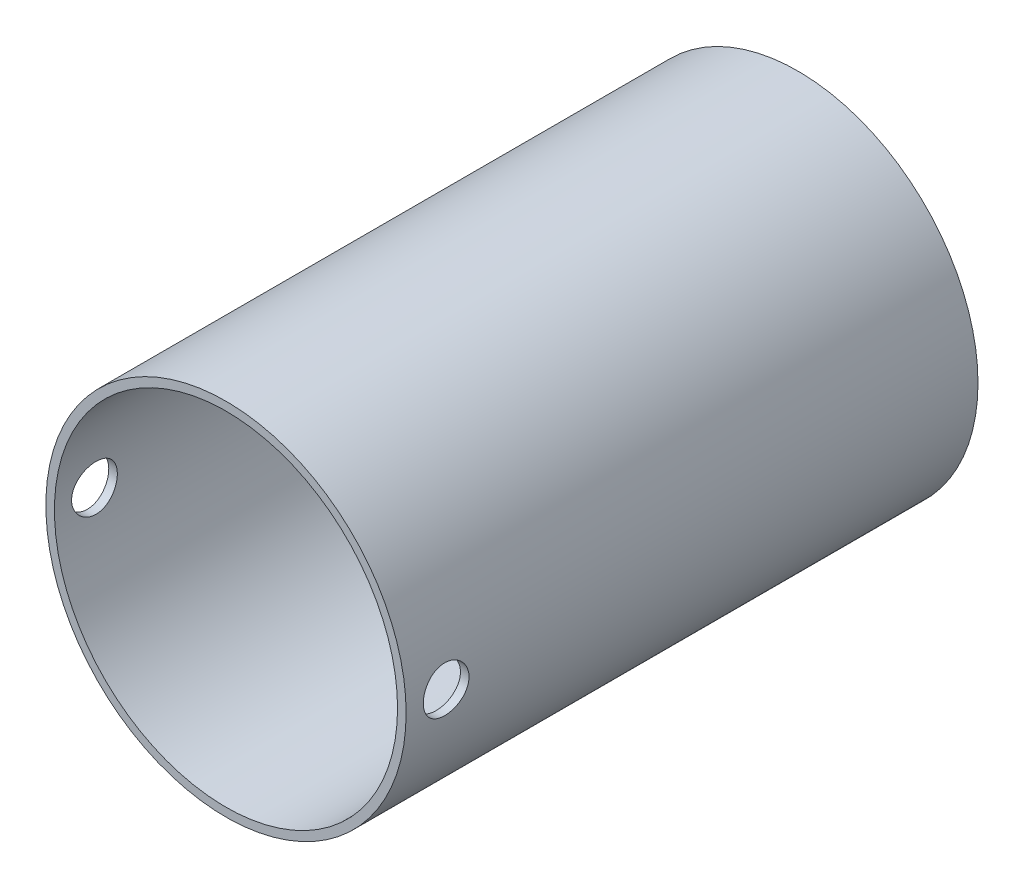
ISO-10303-21;
HEADER;
FILE_DESCRIPTION(('STEP AP214'),'2;1');
FILE_NAME('part.step','',(''),(''),'','','');
FILE_SCHEMA(('AUTOMOTIVE_DESIGN { 1 0 10303 214 1 1 1 1 }'));
ENDSEC;
DATA;
#1=APPLICATION_CONTEXT('core data for automotive mechanical design processes');
#2=APPLICATION_PROTOCOL_DEFINITION('international standard','automotive_design',2000,#1);
#3=PRODUCT_CONTEXT('',#1,'mechanical');
#4=PRODUCT('Part','Part','',(#3));
#5=PRODUCT_RELATED_PRODUCT_CATEGORY('part','',(#4));
#6=PRODUCT_DEFINITION_FORMATION('','',#4);
#7=PRODUCT_DEFINITION_CONTEXT('part definition',#1,'design');
#8=PRODUCT_DEFINITION('design','',#6,#7);
#9=PRODUCT_DEFINITION_SHAPE('','',#8);
#10=(LENGTH_UNIT() NAMED_UNIT(*) SI_UNIT(.MILLI.,.METRE.));
#11=(NAMED_UNIT(*) PLANE_ANGLE_UNIT() SI_UNIT($,.RADIAN.));
#12=(NAMED_UNIT(*) SI_UNIT($,.STERADIAN.) SOLID_ANGLE_UNIT());
#13=UNCERTAINTY_MEASURE_WITH_UNIT(LENGTH_MEASURE(1.E-05),#10,'distance_accuracy_value','');
#14=(GEOMETRIC_REPRESENTATION_CONTEXT(3) GLOBAL_UNCERTAINTY_ASSIGNED_CONTEXT((#13)) GLOBAL_UNIT_ASSIGNED_CONTEXT((#10,
#11,#12)) REPRESENTATION_CONTEXT('',''));
#15=CARTESIAN_POINT('',(0.,0.,0.));
#16=DIRECTION('',(0.,0.,1.));
#17=DIRECTION('',(1.,0.,0.));
#18=AXIS2_PLACEMENT_3D('',#15,#16,#17);
#19=CARTESIAN_POINT('',(0.,0.,100.));
#20=DIRECTION('',(0.,0.,1.));
#21=DIRECTION('',(1.,0.,0.));
#22=AXIS2_PLACEMENT_3D('',#19,#20,#21);
#23=PLANE('',#22);
#24=CARTESIAN_POINT('',(0.,0.,100.));
#25=DIRECTION('',(0.,0.,1.));
#26=DIRECTION('',(1.,0.,0.));
#27=AXIS2_PLACEMENT_3D('',#24,#25,#26);
#28=CIRCLE('',#27,31.5);
#29=CARTESIAN_POINT('',(31.5,0.,100.));
#30=VERTEX_POINT('',#29);
#31=EDGE_CURVE('E10',#30,#30,#28,.T.);
#32=ORIENTED_EDGE('',*,*,#31,.T.);
#33=EDGE_LOOP('',(#32));
#34=FACE_BOUND('',#33,.T.);
#35=CARTESIAN_POINT('',(0.,0.,100.));
#36=DIRECTION('',(0.,0.,1.));
#37=DIRECTION('',(1.,0.,0.));
#38=AXIS2_PLACEMENT_3D('',#35,#36,#37);
#39=CIRCLE('',#38,30.);
#40=CARTESIAN_POINT('',(30.,0.,100.));
#41=VERTEX_POINT('',#40);
#42=EDGE_CURVE('E62',#41,#41,#39,.T.);
#43=ORIENTED_EDGE('',*,*,#42,.F.);
#44=EDGE_LOOP('',(#43));
#45=FACE_BOUND('',#44,.T.);
#46=ADVANCED_FACE('F41',(#34,#45),#23,.T.);
#47=CARTESIAN_POINT('',(0.,0.,0.));
#48=DIRECTION('',(0.,0.,1.));
#49=DIRECTION('',(1.,0.,0.));
#50=AXIS2_PLACEMENT_3D('',#47,#48,#49);
#51=PLANE('',#50);
#52=CARTESIAN_POINT('',(0.,0.,0.));
#53=DIRECTION('',(0.,0.,1.));
#54=DIRECTION('',(1.,0.,0.));
#55=AXIS2_PLACEMENT_3D('',#52,#53,#54);
#56=CIRCLE('',#55,31.5);
#57=CARTESIAN_POINT('',(31.5,0.,0.));
#58=VERTEX_POINT('',#57);
#59=EDGE_CURVE('E56',#58,#58,#56,.T.);
#60=ORIENTED_EDGE('',*,*,#59,.F.);
#61=EDGE_LOOP('',(#60));
#62=FACE_BOUND('',#61,.T.);
#63=CARTESIAN_POINT('',(0.,0.,0.));
#64=DIRECTION('',(0.,0.,1.));
#65=DIRECTION('',(1.,0.,0.));
#66=AXIS2_PLACEMENT_3D('',#63,#64,#65);
#67=CIRCLE('',#66,30.);
#68=CARTESIAN_POINT('',(30.,0.,0.));
#69=VERTEX_POINT('',#68);
#70=EDGE_CURVE('E65',#69,#69,#67,.T.);
#71=ORIENTED_EDGE('',*,*,#70,.T.);
#72=EDGE_LOOP('',(#71));
#73=FACE_BOUND('',#72,.T.);
#74=ADVANCED_FACE('F106',(#62,#73),#51,.F.);
#75=CARTESIAN_POINT('',(0.,0.,100.));
#76=DIRECTION('',(0.,0.,-1.));
#77=DIRECTION('',(-1.,0.,0.));
#78=AXIS2_PLACEMENT_3D('',#75,#76,#77);
#79=CYLINDRICAL_SURFACE('',#78,31.5);
#80=CARTESIAN_POINT('',(-31.5,0.,89.));
#81=CARTESIAN_POINT('',(-31.4999968385272,0.223715988029636,89.0000094860178));
#82=CARTESIAN_POINT('',(-31.4975915656665,0.447571046953038,89.0188316023286));
#83=CARTESIAN_POINT('',(-31.4882278259735,0.889050007646821,89.0936184412233));
#84=CARTESIAN_POINT('',(-31.4812646283541,1.10666718973841,89.1496217559896));
#85=CARTESIAN_POINT('',(-31.4635693402177,1.52921533330555,89.29709264295));
#86=CARTESIAN_POINT('',(-31.452839809906,1.73415480156244,89.3885361286895));
#87=CARTESIAN_POINT('',(-31.4288046328235,2.12574055461283,89.6042384691209));
#88=CARTESIAN_POINT('',(-31.4154994218823,2.31238992622698,89.7284917733744));
#89=CARTESIAN_POINT('',(-31.3877135536644,2.66319458837522,90.0070401736119));
#90=CARTESIAN_POINT('',(-31.3732272833207,2.82723114008826,90.1614842648427));
#91=CARTESIAN_POINT('',(-31.3447571495527,3.12713101980096,90.4957101735464));
#92=CARTESIAN_POINT('',(-31.330773311993,3.26299289911508,90.6754932931038));
#93=CARTESIAN_POINT('',(-31.3048361557336,3.50313059708383,91.0560674820019));
#94=CARTESIAN_POINT('',(-31.2928900697002,3.60729489508019,91.2569294549346));
#95=CARTESIAN_POINT('',(-31.2724552247304,3.78036835194999,91.6734725666853));
#96=CARTESIAN_POINT('',(-31.2639663305768,3.84927888969153,91.8891531255348));
#97=CARTESIAN_POINT('',(-31.2514607408546,3.94952729224959,92.3279773835993));
#98=CARTESIAN_POINT('',(-31.2474201634467,3.98106586774558,92.551074538426));
#99=CARTESIAN_POINT('',(-31.2441956526057,4.00629620054563,92.9994288649798));
#100=CARTESIAN_POINT('',(-31.2450115178251,3.99998952690939,93.22468594677));
#101=CARTESIAN_POINT('',(-31.2513858552307,3.94987309056605,93.6695657327025));
#102=CARTESIAN_POINT('',(-31.2569163452738,3.90628459707475,93.8892138211563));
#103=CARTESIAN_POINT('',(-31.2720531348819,3.78318715505679,94.3180524005092));
#104=CARTESIAN_POINT('',(-31.2816595194392,3.70367745748402,94.527242673236));
#105=CARTESIAN_POINT('',(-31.3038973648617,3.5107573288836,94.9299138357906));
#106=CARTESIAN_POINT('',(-31.3165373696133,3.39725092155177,95.1233482521866));
#107=CARTESIAN_POINT('',(-31.3434116686128,3.13962804024007,95.4885074957042));
#108=CARTESIAN_POINT('',(-31.357646038089,2.99551012160296,95.6602312976205));
#109=CARTESIAN_POINT('',(-31.3862295409855,2.67952976741088,95.9783788820895));
#110=CARTESIAN_POINT('',(-31.4005787683682,2.50747664413859,96.1246133340613));
#111=CARTESIAN_POINT('',(-31.4276801792938,2.14116591323289,96.386156388007));
#112=CARTESIAN_POINT('',(-31.4404323589506,1.94690825156947,96.5014649147269));
#113=CARTESIAN_POINT('',(-31.4629111251128,1.54155537823476,96.6978837716117));
#114=CARTESIAN_POINT('',(-31.4726366447289,1.33045426216087,96.7789820463288));
#115=CARTESIAN_POINT('',(-31.4879566727442,0.897479561472162,96.9045269748191));
#116=CARTESIAN_POINT('',(-31.4935513807666,0.67560649796854,96.9489753997238));
#117=CARTESIAN_POINT('',(-31.4999534285672,0.229022889366789,96.9997130494362));
#118=CARTESIAN_POINT('',(-31.5007934836124,0.00434242215663762,97.00626304833));
#119=CARTESIAN_POINT('',(-31.4976799565989,-0.442913058577919,96.9817063930831));
#120=CARTESIAN_POINT('',(-31.4937264799686,-0.665488118299924,96.9506005671406));
#121=CARTESIAN_POINT('',(-31.4814904877344,-1.10144374404205,96.8518318962107));
#122=CARTESIAN_POINT('',(-31.473222722907,-1.31485297428713,96.7842935893838));
#123=CARTESIAN_POINT('',(-31.4532836620352,-1.72731635019035,96.6147067350875));
#124=CARTESIAN_POINT('',(-31.4416122470706,-1.92636999397529,96.5126569818022));
#125=CARTESIAN_POINT('',(-31.4160852471459,-2.30563511866451,96.2763145258608));
#126=CARTESIAN_POINT('',(-31.4022183857714,-2.4857408582415,96.1418533762043));
#127=CARTESIAN_POINT('',(-31.373886434308,-2.82092133636619,95.8447430151219));
#128=CARTESIAN_POINT('',(-31.3594213197024,-2.97599504780794,95.6820926476129));
#129=CARTESIAN_POINT('',(-31.3314220283463,-3.25763645168321,95.3320712926267));
#130=CARTESIAN_POINT('',(-31.3178938267114,-3.38403113744103,95.1445605491064));
#131=CARTESIAN_POINT('',(-31.293398902391,-3.60353087261144,94.7508183998289));
#132=CARTESIAN_POINT('',(-31.2824321269796,-3.69663660728627,94.5445873795433));
#133=CARTESIAN_POINT('',(-31.2643426408956,-3.84663628723283,94.1198139454469));
#134=CARTESIAN_POINT('',(-31.2572096339925,-3.903627299211,93.9013062659036));
#135=CARTESIAN_POINT('',(-31.2475659310234,-3.98009210669879,93.4577258637377));
#136=CARTESIAN_POINT('',(-31.2450550124773,-3.99956770798083,93.2326534576322));
#137=CARTESIAN_POINT('',(-31.244946400951,-4.00041500529707,92.7840539863469));
#138=CARTESIAN_POINT('',(-31.2473136596187,-3.98205851430746,92.5605273944412));
#139=CARTESIAN_POINT('',(-31.2566192596448,-3.90833879568297,92.1197641943916));
#140=CARTESIAN_POINT('',(-31.2635576010018,-3.85297556805973,91.9025275862458));
#141=CARTESIAN_POINT('',(-31.2812126450123,-3.70689975530109,91.4805495834385));
#142=CARTESIAN_POINT('',(-31.2919279013377,-3.6162007002348,91.2758034408484));
#143=CARTESIAN_POINT('',(-31.3159317720176,-3.40205458104029,90.8843928132592));
#144=CARTESIAN_POINT('',(-31.3292204226875,-3.27860705476148,90.6977285834851));
#145=CARTESIAN_POINT('',(-31.3569881289507,-3.00146122414133,90.3463915971546));
#146=CARTESIAN_POINT('',(-31.3714747534284,-2.84756041362568,90.1818791703885));
#147=CARTESIAN_POINT('',(-31.3999395620211,-2.51429978698193,89.8809114523834));
#148=CARTESIAN_POINT('',(-31.4139176255988,-2.33493398398539,89.7444627775111));
#149=CARTESIAN_POINT('',(-31.4398510921941,-1.95502619095532,89.5030382329854));
#150=CARTESIAN_POINT('',(-31.4517983479301,-1.75440391254395,89.3981878893078));
#151=CARTESIAN_POINT('',(-31.4722417520154,-1.33835826680321,89.2238162935201));
#152=CARTESIAN_POINT('',(-31.4807416355615,-1.12295121622904,89.1542567834869));
#153=CARTESIAN_POINT('',(-31.4912914915295,-0.755366800765215,89.0690286687568));
#154=CARTESIAN_POINT('',(-31.4945412100071,-0.605504101781294,89.0431802905911));
#155=CARTESIAN_POINT('',(-31.4988965294497,-0.303782303051817,89.0086628014211));
#156=CARTESIAN_POINT('',(-31.5000021469235,-0.151923218686825,88.9999935581432));
#157=CARTESIAN_POINT('',(-31.5,0.,89.));
#158=B_SPLINE_CURVE_WITH_KNOTS('',3,(#80,#81,#82,#83,#84,#85,#86,#87,#88,#89,#90,#91,#92,#93,
#94,#95,#96,#97,#98,#99,#100,#101,#102,#103,#104,#105,#106,#107,#108,#109,#110,#111,#112,#113,
#114,#115,#116,#117,#118,#119,#120,#121,#122,#123,#124,#125,#126,#127,#128,#129,#130,#131,#132,
#133,#134,#135,#136,#137,#138,#139,#140,#141,#142,#143,#144,#145,#146,#147,#148,#149,#150,#151,
#152,#153,#154,#155,#156,#157),.UNSPECIFIED.,.T.,.F.,(4,2,2,2,2,2,2,2,2,2,2,2,2,2,2,2,2,2,2,2,2,
2,2,2,2,2,2,2,2,2,2,2,2,2,2,2,2,2,4),(0.,0.670593021042296,1.34188317380553,2.01271789068873,
2.68343919505851,3.35755819670733,4.03171185162278,4.70821064582307,5.38468297833752,
6.05750552549398,6.73030017769763,7.39912925432749,8.06797227834447,8.738721605591,
9.40950259472595,10.0850713656251,10.7606417804119,11.4364500629031,12.1122256845373,
12.7833458014479,13.4544511580829,14.123276860759,14.7921259343465,15.4645290510101,
16.1369597504884,16.8133450010221,17.4897163271775,18.1642619504989,18.8387751043285,
19.5084589678988,20.1781428312585,20.8475705246481,21.5170076655889,22.1910557893549,
22.8652626463561,23.542113551401,24.2182291227463,24.6736254291239,25.1290182290885),.UNSPECIFIED.);
#159=CARTESIAN_POINT('',(-31.5,0.,89.));
#160=VERTEX_POINT('',#159);
#161=EDGE_CURVE('E92',#160,#160,#158,.T.);
#162=ORIENTED_EDGE('',*,*,#161,.T.);
#163=EDGE_LOOP('',(#162));
#164=FACE_BOUND('',#163,.T.);
#165=CARTESIAN_POINT('',(31.5,0.,89.));
#166=CARTESIAN_POINT('',(31.4999968385272,-0.223715988029636,89.0000094860178));
#167=CARTESIAN_POINT('',(31.4975915656665,-0.447571046953038,89.0188316023286));
#168=CARTESIAN_POINT('',(31.4882278259735,-0.889050007646821,89.0936184412233));
#169=CARTESIAN_POINT('',(31.4812646283541,-1.10666718973841,89.1496217559896));
#170=CARTESIAN_POINT('',(31.4635693402177,-1.52921533330555,89.29709264295));
#171=CARTESIAN_POINT('',(31.452839809906,-1.73415480156244,89.3885361286895));
#172=CARTESIAN_POINT('',(31.4288046328235,-2.12574055461283,89.6042384691209));
#173=CARTESIAN_POINT('',(31.4154994218823,-2.31238992622698,89.7284917733744));
#174=CARTESIAN_POINT('',(31.3877135536644,-2.66319458837522,90.0070401736119));
#175=CARTESIAN_POINT('',(31.3732272833207,-2.82723114008826,90.1614842648427));
#176=CARTESIAN_POINT('',(31.3447571495527,-3.12713101980096,90.4957101735464));
#177=CARTESIAN_POINT('',(31.330773311993,-3.26299289911508,90.6754932931038));
#178=CARTESIAN_POINT('',(31.3048361557336,-3.50313059708383,91.0560674820019));
#179=CARTESIAN_POINT('',(31.2928900697002,-3.60729489508019,91.2569294549346));
#180=CARTESIAN_POINT('',(31.2724552247304,-3.78036835194999,91.6734725666853));
#181=CARTESIAN_POINT('',(31.2639663305768,-3.84927888969153,91.8891531255348));
#182=CARTESIAN_POINT('',(31.2514607408546,-3.94952729224959,92.3279773835993));
#183=CARTESIAN_POINT('',(31.2474201634467,-3.98106586774558,92.551074538426));
#184=CARTESIAN_POINT('',(31.2441956526057,-4.00629620054563,92.9994288649798));
#185=CARTESIAN_POINT('',(31.2450115178251,-3.99998952690939,93.22468594677));
#186=CARTESIAN_POINT('',(31.2513858552307,-3.94987309056605,93.6695657327025));
#187=CARTESIAN_POINT('',(31.2569163452738,-3.90628459707475,93.8892138211563));
#188=CARTESIAN_POINT('',(31.2720531348819,-3.78318715505679,94.3180524005092));
#189=CARTESIAN_POINT('',(31.2816595194392,-3.70367745748402,94.527242673236));
#190=CARTESIAN_POINT('',(31.3038973648617,-3.5107573288836,94.9299138357906));
#191=CARTESIAN_POINT('',(31.3165373696133,-3.39725092155177,95.1233482521866));
#192=CARTESIAN_POINT('',(31.3434116686128,-3.13962804024007,95.4885074957042));
#193=CARTESIAN_POINT('',(31.357646038089,-2.99551012160296,95.6602312976205));
#194=CARTESIAN_POINT('',(31.3862295409855,-2.67952976741088,95.9783788820895));
#195=CARTESIAN_POINT('',(31.4005787683682,-2.50747664413859,96.1246133340613));
#196=CARTESIAN_POINT('',(31.4276801792938,-2.14116591323289,96.386156388007));
#197=CARTESIAN_POINT('',(31.4404323589506,-1.94690825156947,96.5014649147269));
#198=CARTESIAN_POINT('',(31.4629111251128,-1.54155537823476,96.6978837716117));
#199=CARTESIAN_POINT('',(31.4726366447289,-1.33045426216087,96.7789820463288));
#200=CARTESIAN_POINT('',(31.4879566727442,-0.897479561472162,96.9045269748191));
#201=CARTESIAN_POINT('',(31.4935513807666,-0.67560649796854,96.9489753997238));
#202=CARTESIAN_POINT('',(31.4999534285672,-0.229022889366789,96.9997130494362));
#203=CARTESIAN_POINT('',(31.5007934836124,-0.00434242215663762,97.00626304833));
#204=CARTESIAN_POINT('',(31.4976799565989,0.442913058577919,96.9817063930831));
#205=CARTESIAN_POINT('',(31.4937264799686,0.665488118299924,96.9506005671406));
#206=CARTESIAN_POINT('',(31.4814904877344,1.10144374404205,96.8518318962107));
#207=CARTESIAN_POINT('',(31.473222722907,1.31485297428713,96.7842935893838));
#208=CARTESIAN_POINT('',(31.4532836620352,1.72731635019035,96.6147067350875));
#209=CARTESIAN_POINT('',(31.4416122470706,1.92636999397529,96.5126569818022));
#210=CARTESIAN_POINT('',(31.4160852471459,2.30563511866451,96.2763145258608));
#211=CARTESIAN_POINT('',(31.4022183857714,2.4857408582415,96.1418533762043));
#212=CARTESIAN_POINT('',(31.373886434308,2.82092133636619,95.8447430151219));
#213=CARTESIAN_POINT('',(31.3594213197024,2.97599504780794,95.6820926476129));
#214=CARTESIAN_POINT('',(31.3314220283463,3.25763645168321,95.3320712926267));
#215=CARTESIAN_POINT('',(31.3178938267114,3.38403113744103,95.1445605491064));
#216=CARTESIAN_POINT('',(31.293398902391,3.60353087261144,94.7508183998289));
#217=CARTESIAN_POINT('',(31.2824321269796,3.69663660728627,94.5445873795433));
#218=CARTESIAN_POINT('',(31.2643426408956,3.84663628723283,94.1198139454469));
#219=CARTESIAN_POINT('',(31.2572096339925,3.903627299211,93.9013062659036));
#220=CARTESIAN_POINT('',(31.2475659310234,3.98009210669879,93.4577258637377));
#221=CARTESIAN_POINT('',(31.2450550124773,3.99956770798083,93.2326534576322));
#222=CARTESIAN_POINT('',(31.244946400951,4.00041500529707,92.7840539863469));
#223=CARTESIAN_POINT('',(31.2473136596187,3.98205851430746,92.5605273944412));
#224=CARTESIAN_POINT('',(31.2566192596448,3.90833879568297,92.1197641943916));
#225=CARTESIAN_POINT('',(31.2635576010018,3.85297556805973,91.9025275862458));
#226=CARTESIAN_POINT('',(31.2812126450123,3.70689975530109,91.4805495834385));
#227=CARTESIAN_POINT('',(31.2919279013377,3.6162007002348,91.2758034408484));
#228=CARTESIAN_POINT('',(31.3159317720176,3.40205458104029,90.8843928132592));
#229=CARTESIAN_POINT('',(31.3292204226875,3.27860705476148,90.6977285834851));
#230=CARTESIAN_POINT('',(31.3569881289507,3.00146122414133,90.3463915971546));
#231=CARTESIAN_POINT('',(31.3714747534284,2.84756041362568,90.1818791703885));
#232=CARTESIAN_POINT('',(31.3999395620211,2.51429978698193,89.8809114523834));
#233=CARTESIAN_POINT('',(31.4139176255988,2.33493398398539,89.7444627775111));
#234=CARTESIAN_POINT('',(31.4398510921941,1.95502619095532,89.5030382329854));
#235=CARTESIAN_POINT('',(31.4517983479301,1.75440391254395,89.3981878893078));
#236=CARTESIAN_POINT('',(31.4722417520154,1.33835826680321,89.2238162935201));
#237=CARTESIAN_POINT('',(31.4807416355615,1.12295121622904,89.1542567834869));
#238=CARTESIAN_POINT('',(31.4912914915295,0.755366800765215,89.0690286687568));
#239=CARTESIAN_POINT('',(31.4945412100071,0.605504101781294,89.0431802905911));
#240=CARTESIAN_POINT('',(31.4988965294497,0.303782303051817,89.0086628014211));
#241=CARTESIAN_POINT('',(31.5000021469235,0.151923218686825,88.9999935581432));
#242=CARTESIAN_POINT('',(31.5,0.,89.));
#243=B_SPLINE_CURVE_WITH_KNOTS('',3,(#165,#166,#167,#168,#169,#170,#171,#172,#173,#174,#175,
#176,#177,#178,#179,#180,#181,#182,#183,#184,#185,#186,#187,#188,#189,#190,#191,#192,#193,#194,
#195,#196,#197,#198,#199,#200,#201,#202,#203,#204,#205,#206,#207,#208,#209,#210,#211,#212,#213,
#214,#215,#216,#217,#218,#219,#220,#221,#222,#223,#224,#225,#226,#227,#228,#229,#230,#231,#232,
#233,#234,#235,#236,#237,#238,#239,#240,#241,#242),.UNSPECIFIED.,.T.,.F.,(4,2,2,2,2,2,2,2,2,2,2,
2,2,2,2,2,2,2,2,2,2,2,2,2,2,2,2,2,2,2,2,2,2,2,2,2,2,2,4),(0.,0.670593021042296,1.34188317380553,
2.01271789068873,2.68343919505851,3.35755819670733,4.03171185162278,4.70821064582307,
5.38468297833752,6.05750552549398,6.73030017769763,7.39912925432749,8.06797227834447,
8.738721605591,9.40950259472595,10.0850713656251,10.7606417804119,11.4364500629031,
12.1122256845373,12.7833458014479,13.4544511580829,14.123276860759,14.7921259343465,
15.4645290510101,16.1369597504884,16.8133450010221,17.4897163271775,18.1642619504989,
18.8387751043285,19.5084589678988,20.1781428312585,20.8475705246481,21.5170076655889,
22.1910557893549,22.8652626463561,23.542113551401,24.2182291227463,24.6736254291239,
25.1290182290885),.UNSPECIFIED.);
#244=CARTESIAN_POINT('',(31.5,0.,89.));
#245=VERTEX_POINT('',#244);
#246=EDGE_CURVE('E86',#245,#245,#243,.T.);
#247=ORIENTED_EDGE('',*,*,#246,.T.);
#248=EDGE_LOOP('',(#247));
#249=FACE_BOUND('',#248,.T.);
#250=ORIENTED_EDGE('',*,*,#31,.F.);
#251=EDGE_LOOP('',(#250));
#252=FACE_BOUND('',#251,.T.);
#253=ORIENTED_EDGE('',*,*,#59,.T.);
#254=EDGE_LOOP('',(#253));
#255=FACE_BOUND('',#254,.T.);
#256=ADVANCED_FACE('F43',(#164,#249,#252,#255),#79,.T.);
#257=CARTESIAN_POINT('',(0.,0.,100.));
#258=DIRECTION('',(0.,0.,-1.));
#259=DIRECTION('',(-1.,0.,0.));
#260=AXIS2_PLACEMENT_3D('',#257,#258,#259);
#261=CYLINDRICAL_SURFACE('',#260,30.);
#262=CARTESIAN_POINT('',(-30.,0.,97.));
#263=CARTESIAN_POINT('',(-29.9999967148509,-0.223617671338569,96.9999905805862));
#264=CARTESIAN_POINT('',(-29.9974734145439,-0.44737195855256,96.9811849240751));
#265=CARTESIAN_POINT('',(-29.9876502225381,-0.888645450276159,96.9064673019009));
#266=CARTESIAN_POINT('',(-29.9803454488345,-1.10615804466608,96.8505174102057));
#267=CARTESIAN_POINT('',(-29.9617815969813,-1.52849662525397,96.7031965649171));
#268=CARTESIAN_POINT('',(-29.9505252842195,-1.73333136611699,96.6118503779231));
#269=CARTESIAN_POINT('',(-29.9253077332078,-2.1247277900606,96.3963861723875));
#270=CARTESIAN_POINT('',(-29.9113469311713,-2.31129241267406,96.2722734376671));
#271=CARTESIAN_POINT('',(-29.8821798957993,-2.66205164500936,95.9939734767916));
#272=CARTESIAN_POINT('',(-29.8669671632422,-2.82611597099172,95.8396227099831));
#273=CARTESIAN_POINT('',(-29.837062751159,-3.12609471346203,95.5055796218467));
#274=CARTESIAN_POINT('',(-29.8223710992468,-3.26200763994443,95.3258859600084));
#275=CARTESIAN_POINT('',(-29.7951087088038,-3.50231804537815,94.9454017541099));
#276=CARTESIAN_POINT('',(-29.7825463553152,-3.60659214965156,94.7445326350428));
#277=CARTESIAN_POINT('',(-29.7610517475846,-3.77987690014581,94.3279378655264));
#278=CARTESIAN_POINT('',(-29.7521193370242,-3.84888906490556,94.1122128552934));
#279=CARTESIAN_POINT('',(-29.7389587313734,-3.94929213544348,93.6733883789967));
#280=CARTESIAN_POINT('',(-29.7347029074027,-3.98090408457014,93.4503403309342));
#281=CARTESIAN_POINT('',(-29.7312930321863,-4.00629361096235,93.0020676407881));
#282=CARTESIAN_POINT('',(-29.732138748408,-4.00007291267203,92.7768430983782));
#283=CARTESIAN_POINT('',(-29.7388111154598,-3.9501549187847,92.3321577399441));
#284=CARTESIAN_POINT('',(-29.7446052924469,-3.90670195063524,92.1126689402286));
#285=CARTESIAN_POINT('',(-29.7604710554949,-3.78393449268744,91.6841263264798));
#286=CARTESIAN_POINT('',(-29.7705427390826,-3.70461918522915,91.47507275049));
#287=CARTESIAN_POINT('',(-29.7938652222205,-3.51211858286383,91.0725807305856));
#288=CARTESIAN_POINT('',(-29.807125882478,-3.39882795827499,90.8791932576114));
#289=CARTESIAN_POINT('',(-29.8353247243987,-3.14166786688579,90.5140818361647));
#290=CARTESIAN_POINT('',(-29.8502629932706,-2.99779681004771,90.3423590148917));
#291=CARTESIAN_POINT('',(-29.8802779846717,-2.68220980052725,90.0240339748362));
#292=CARTESIAN_POINT('',(-29.895354870824,-2.51028341405289,89.8776403145953));
#293=CARTESIAN_POINT('',(-29.9238384763653,-2.14418834026682,89.6157559101432));
#294=CARTESIAN_POINT('',(-29.9372451909431,-1.95001958888474,89.500265254953));
#295=CARTESIAN_POINT('',(-29.9608878748716,-1.54478443946094,89.3034617646105));
#296=CARTESIAN_POINT('',(-29.9711225441791,-1.33371115768246,89.2221629379074));
#297=CARTESIAN_POINT('',(-29.9872565180814,-0.900741848672499,89.0962213620553));
#298=CARTESIAN_POINT('',(-29.9931560537986,-0.678846399084515,89.0515766587212));
#299=CARTESIAN_POINT('',(-29.9999248275371,-0.232333806651289,89.0004831344578));
#300=CARTESIAN_POINT('',(-30.0008318769809,-0.00775006909408505,88.993747196433));
#301=CARTESIAN_POINT('',(-29.9976158307704,0.439343234437437,89.0179033282544));
#302=CARTESIAN_POINT('',(-29.993492857372,0.66185285069133,89.0487944835647));
#303=CARTESIAN_POINT('',(-29.980703507162,1.09762743114588,89.147089306768));
#304=CARTESIAN_POINT('',(-29.9720542860584,1.3109240330241,89.2143551366443));
#305=CARTESIAN_POINT('',(-29.9511801850858,1.72321019758712,89.3833459318742));
#306=CARTESIAN_POINT('',(-29.9389551687888,1.92219921403128,89.4850722120265));
#307=CARTESIAN_POINT('',(-29.9121967474015,2.30149775723216,89.7207843111666));
#308=CARTESIAN_POINT('',(-29.8976503009143,2.48169162879321,89.8549547314267));
#309=CARTESIAN_POINT('',(-29.8679145741996,2.8171058939838,90.1514866584485));
#310=CARTESIAN_POINT('',(-29.8527252648124,2.97232515324758,90.3138494450329));
#311=CARTESIAN_POINT('',(-29.8232980494702,3.25441098846197,90.6634262852791));
#312=CARTESIAN_POINT('',(-29.809066975506,3.38108655217877,90.8507951334763));
#313=CARTESIAN_POINT('',(-29.7832826600363,3.60116702157629,91.2443188205619));
#314=CARTESIAN_POINT('',(-29.7717293587357,3.69457267020694,91.4504732398208));
#315=CARTESIAN_POINT('',(-29.7526562356016,3.84515673001493,91.8751144840554));
#316=CARTESIAN_POINT('',(-29.745124684652,3.90244057693592,92.0935633704216));
#317=CARTESIAN_POINT('',(-29.7349149739658,3.97949334287918,92.5370872642575));
#318=CARTESIAN_POINT('',(-29.7322365546268,3.99926426853564,92.7621619166489));
#319=CARTESIAN_POINT('',(-29.732044625909,4.00068971612379,93.210646981707));
#320=CARTESIAN_POINT('',(-29.7344904456504,3.98264438388986,93.4340564819285));
#321=CARTESIAN_POINT('',(-29.744183677484,3.90958753373379,93.8746357502077));
#322=CARTESIAN_POINT('',(-29.7514310877766,3.85457602966538,94.091805520604));
#323=CARTESIAN_POINT('',(-29.7698978054553,3.70924620664415,94.5136873665032));
#324=CARTESIAN_POINT('',(-29.781115253188,3.61894441638083,94.7184052222337));
#325=CARTESIAN_POINT('',(-29.8062609142564,3.40562685519476,95.1098317676521));
#326=CARTESIAN_POINT('',(-29.820189179932,3.28261045260858,95.2965401095121));
#327=CARTESIAN_POINT('',(-29.8493193436612,3.00624897019017,95.6481792998568));
#328=CARTESIAN_POINT('',(-29.8645301150816,2.85268054453802,95.8129338955103));
#329=CARTESIAN_POINT('',(-29.8944343800333,2.52004338699647,96.1144464327231));
#330=CARTESIAN_POINT('',(-29.9091277513796,2.34096868145955,96.2511977975005));
#331=CARTESIAN_POINT('',(-29.9364127027506,1.96150597570564,96.4933342769331));
#332=CARTESIAN_POINT('',(-29.9489949285378,1.76102924148792,96.5985813331105));
#333=CARTESIAN_POINT('',(-29.9705464131794,1.34518481917465,96.7737611970902));
#334=CARTESIAN_POINT('',(-29.9795195384862,1.12983335793978,96.8437318172497));
#335=CARTESIAN_POINT('',(-29.9907144348653,0.761176816196839,96.9298960127704));
#336=CARTESIAN_POINT('',(-29.9941792727015,0.610182163911559,96.9561464870473));
#337=CARTESIAN_POINT('',(-29.9988231698154,0.306146343232225,96.991201628331));
#338=CARTESIAN_POINT('',(-30.000002249256,0.153105192902481,97.0000064492272));
#339=CARTESIAN_POINT('',(-30.,0.,97.));
#340=B_SPLINE_CURVE_WITH_KNOTS('',3,(#262,#263,#264,#265,#266,#267,#268,#269,#270,#271,#272,
#273,#274,#275,#276,#277,#278,#279,#280,#281,#282,#283,#284,#285,#286,#287,#288,#289,#290,#291,
#292,#293,#294,#295,#296,#297,#298,#299,#300,#301,#302,#303,#304,#305,#306,#307,#308,#309,#310,
#311,#312,#313,#314,#315,#316,#317,#318,#319,#320,#321,#322,#323,#324,#325,#326,#327,#328,#329,
#330,#331,#332,#333,#334,#335,#336,#337,#338,#339),.UNSPECIFIED.,.T.,.F.,(4,2,2,2,2,2,2,2,2,2,2,
2,2,2,2,2,2,2,2,2,2,2,2,2,2,2,2,2,2,2,2,2,2,2,2,2,2,2,4),(0.,0.670293702611487,1.34127286177009,
2.01178338565482,2.68218585128069,3.35631956887118,4.03048895809672,4.70725443023295,
5.3839907553241,6.05670711828719,6.72939281849841,7.39769770196088,8.06601782351701,
8.73643166275795,9.40688036887596,10.082610889697,10.7583433570459,11.4343524040508,
12.1103254078349,12.7811716998412,13.4520016870896,14.1203072679293,14.7886383500709,
15.4608654953977,16.1331231651753,16.809754090709,17.486369905461,18.1610014947091,
18.8355969956727,19.5048585499325,20.1741198533749,20.8430680740524,21.5120292119181,
22.1860733567022,22.8602756250233,23.5373905334904,24.2137780998484,24.6727147809462,
25.1316474137088),.UNSPECIFIED.);
#341=CARTESIAN_POINT('',(-30.,0.,97.));
#342=VERTEX_POINT('',#341);
#343=EDGE_CURVE('E46',#342,#342,#340,.T.);
#344=ORIENTED_EDGE('',*,*,#343,.F.);
#345=EDGE_LOOP('',(#344));
#346=FACE_BOUND('',#345,.T.);
#347=CARTESIAN_POINT('',(30.,0.,89.));
#348=CARTESIAN_POINT('',(29.9999967148509,-0.223617671338569,89.0000094194138));
#349=CARTESIAN_POINT('',(29.9974734145439,-0.447371958552561,89.0188150759249));
#350=CARTESIAN_POINT('',(29.9876502225381,-0.888645450276159,89.0935326980991));
#351=CARTESIAN_POINT('',(29.9803454488345,-1.10615804466607,89.1494825897943));
#352=CARTESIAN_POINT('',(29.9617815969813,-1.52849662525396,89.2968034350829));
#353=CARTESIAN_POINT('',(29.9505252842195,-1.73333136611698,89.3881496220769));
#354=CARTESIAN_POINT('',(29.9253077332078,-2.12472779006059,89.6036138276125));
#355=CARTESIAN_POINT('',(29.9113469311713,-2.31129241267405,89.7277265623329));
#356=CARTESIAN_POINT('',(29.8821798957993,-2.66205164500936,90.0060265232083));
#357=CARTESIAN_POINT('',(29.8669671632422,-2.82611597099173,90.1603772900169));
#358=CARTESIAN_POINT('',(29.837062751159,-3.12609471346204,90.4944203781533));
#359=CARTESIAN_POINT('',(29.8223710992468,-3.26200763994443,90.6741140399916));
#360=CARTESIAN_POINT('',(29.7951087088038,-3.50231804537815,91.0545982458901));
#361=CARTESIAN_POINT('',(29.7825463553152,-3.60659214965156,91.2554673649572));
#362=CARTESIAN_POINT('',(29.7610517475846,-3.77987690014581,91.6720621344736));
#363=CARTESIAN_POINT('',(29.7521193370242,-3.84888906490556,91.8877871447066));
#364=CARTESIAN_POINT('',(29.7389587313734,-3.94929213544348,92.3266116210033));
#365=CARTESIAN_POINT('',(29.7347029074027,-3.98090408457014,92.5496596690658));
#366=CARTESIAN_POINT('',(29.7312930321863,-4.00629361096235,92.9979323592119));
#367=CARTESIAN_POINT('',(29.732138748408,-4.00007291267203,93.2231569016218));
#368=CARTESIAN_POINT('',(29.7388111154598,-3.9501549187847,93.6678422600559));
#369=CARTESIAN_POINT('',(29.7446052924469,-3.90670195063524,93.8873310597714));
#370=CARTESIAN_POINT('',(29.7604710554949,-3.78393449268744,94.3158736735202));
#371=CARTESIAN_POINT('',(29.7705427390826,-3.70461918522915,94.52492724951));
#372=CARTESIAN_POINT('',(29.7938652222205,-3.51211858286383,94.9274192694144));
#373=CARTESIAN_POINT('',(29.807125882478,-3.39882795827499,95.1208067423886));
#374=CARTESIAN_POINT('',(29.8353247243987,-3.14166786688579,95.4859181638353));
#375=CARTESIAN_POINT('',(29.8502629932706,-2.99779681004771,95.6576409851083));
#376=CARTESIAN_POINT('',(29.8802779846717,-2.68220980052725,95.9759660251638));
#377=CARTESIAN_POINT('',(29.895354870824,-2.51028341405289,96.1223596854047));
#378=CARTESIAN_POINT('',(29.9238384763653,-2.14418834026682,96.3842440898568));
#379=CARTESIAN_POINT('',(29.9372451909431,-1.95001958888474,96.499734745047));
#380=CARTESIAN_POINT('',(29.9608878748716,-1.54478443946094,96.6965382353895));
#381=CARTESIAN_POINT('',(29.9711225441791,-1.33371115768246,96.7778370620926));
#382=CARTESIAN_POINT('',(29.9872565180814,-0.900741848672499,96.9037786379447));
#383=CARTESIAN_POINT('',(29.9931560537986,-0.678846399084515,96.9484233412788));
#384=CARTESIAN_POINT('',(29.9999248275371,-0.232333806651289,96.9995168655422));
#385=CARTESIAN_POINT('',(30.0008318769809,-0.00775006909408505,97.006252803567));
#386=CARTESIAN_POINT('',(29.9976158307704,0.439343234437437,96.9820966717456));
#387=CARTESIAN_POINT('',(29.993492857372,0.66185285069133,96.9512055164353));
#388=CARTESIAN_POINT('',(29.980703507162,1.09762743114588,96.852910693232));
#389=CARTESIAN_POINT('',(29.9720542860584,1.3109240330241,96.7856448633557));
#390=CARTESIAN_POINT('',(29.9511801850858,1.72321019758712,96.6166540681258));
#391=CARTESIAN_POINT('',(29.9389551687888,1.92219921403128,96.5149277879735));
#392=CARTESIAN_POINT('',(29.9121967474015,2.30149775723216,96.2792156888334));
#393=CARTESIAN_POINT('',(29.8976503009143,2.48169162879321,96.1450452685733));
#394=CARTESIAN_POINT('',(29.8679145741996,2.8171058939838,95.8485133415515));
#395=CARTESIAN_POINT('',(29.8527252648124,2.97232515324758,95.6861505549671));
#396=CARTESIAN_POINT('',(29.8232980494702,3.25441098846196,95.3365737147209));
#397=CARTESIAN_POINT('',(29.809066975506,3.38108655217876,95.1492048665237));
#398=CARTESIAN_POINT('',(29.7832826600363,3.60116702157628,94.7556811794382));
#399=CARTESIAN_POINT('',(29.7717293587357,3.69457267020693,94.5495267601792));
#400=CARTESIAN_POINT('',(29.7526562356016,3.84515673001493,94.1248855159446));
#401=CARTESIAN_POINT('',(29.745124684652,3.90244057693592,93.9064366295784));
#402=CARTESIAN_POINT('',(29.7349149739658,3.97949334287918,93.4629127357425));
#403=CARTESIAN_POINT('',(29.7322365546268,3.99926426853564,93.2378380833511));
#404=CARTESIAN_POINT('',(29.732044625909,4.00068971612379,92.789353018293));
#405=CARTESIAN_POINT('',(29.7344904456504,3.98264438388986,92.5659435180715));
#406=CARTESIAN_POINT('',(29.744183677484,3.90958753373379,92.1253642497923));
#407=CARTESIAN_POINT('',(29.7514310877766,3.85457602966538,91.908194479396));
#408=CARTESIAN_POINT('',(29.7698978054553,3.70924620664415,91.4863126334968));
#409=CARTESIAN_POINT('',(29.781115253188,3.61894441638083,91.2815947777663));
#410=CARTESIAN_POINT('',(29.8062609142564,3.40562685519476,90.8901682323479));
#411=CARTESIAN_POINT('',(29.820189179932,3.28261045260858,90.7034598904879));
#412=CARTESIAN_POINT('',(29.8493193436612,3.00624897019017,90.3518207001432));
#413=CARTESIAN_POINT('',(29.8645301150816,2.85268054453802,90.1870661044897));
#414=CARTESIAN_POINT('',(29.8944343800333,2.52004338699647,89.8855535672769));
#415=CARTESIAN_POINT('',(29.9091277513796,2.34096868145955,89.7488022024995));
#416=CARTESIAN_POINT('',(29.9364127027506,1.96150597570564,89.5066657230669));
#417=CARTESIAN_POINT('',(29.9489949285378,1.76102924148792,89.4014186668895));
#418=CARTESIAN_POINT('',(29.9705464131794,1.34518481917465,89.2262388029098));
#419=CARTESIAN_POINT('',(29.9795195384862,1.12983335793978,89.1562681827503));
#420=CARTESIAN_POINT('',(29.9907144348653,0.761176816196839,89.0701039872296));
#421=CARTESIAN_POINT('',(29.9941792727015,0.610182163911559,89.0438535129527));
#422=CARTESIAN_POINT('',(29.9988231698154,0.306146343232225,89.008798371669));
#423=CARTESIAN_POINT('',(30.000002249256,0.153105192902481,88.9999935507728));
#424=CARTESIAN_POINT('',(30.,0.,89.));
#425=B_SPLINE_CURVE_WITH_KNOTS('',3,(#347,#348,#349,#350,#351,#352,#353,#354,#355,#356,#357,
#358,#359,#360,#361,#362,#363,#364,#365,#366,#367,#368,#369,#370,#371,#372,#373,#374,#375,#376,
#377,#378,#379,#380,#381,#382,#383,#384,#385,#386,#387,#388,#389,#390,#391,#392,#393,#394,#395,
#396,#397,#398,#399,#400,#401,#402,#403,#404,#405,#406,#407,#408,#409,#410,#411,#412,#413,#414,
#415,#416,#417,#418,#419,#420,#421,#422,#423,#424),.UNSPECIFIED.,.T.,.F.,(4,2,2,2,2,2,2,2,2,2,2,
2,2,2,2,2,2,2,2,2,2,2,2,2,2,2,2,2,2,2,2,2,2,2,2,2,2,2,4),(0.,0.670293702611487,1.34127286177009,
2.0117833856548,2.68218585128069,3.35631956887119,4.03048895809672,4.70725443023295,
5.3839907553241,6.0567071182872,6.72939281849842,7.39769770196089,8.06601782351702,
8.73643166275797,9.40688036887596,10.082610889697,10.7583433570459,11.4343524040508,
12.1103254078349,12.7811716998412,13.4520016870896,14.1203072679293,14.7886383500709,
15.4608654953977,16.1331231651753,16.809754090709,17.486369905461,18.1610014947091,
18.8355969956727,19.5048585499325,20.1741198533749,20.8430680740524,21.5120292119181,
22.1860733567022,22.8602756250233,23.5373905334904,24.2137780998484,24.6727147809462,
25.1316474137088),.UNSPECIFIED.);
#426=CARTESIAN_POINT('',(30.,0.,89.));
#427=VERTEX_POINT('',#426);
#428=EDGE_CURVE('E67',#427,#427,#425,.T.);
#429=ORIENTED_EDGE('',*,*,#428,.F.);
#430=EDGE_LOOP('',(#429));
#431=FACE_BOUND('',#430,.T.);
#432=ORIENTED_EDGE('',*,*,#42,.T.);
#433=EDGE_LOOP('',(#432));
#434=FACE_BOUND('',#433,.T.);
#435=ORIENTED_EDGE('',*,*,#70,.F.);
#436=EDGE_LOOP('',(#435));
#437=FACE_BOUND('',#436,.T.);
#438=ADVANCED_FACE('F73',(#346,#431,#434,#437),#261,.F.);
#439=CARTESIAN_POINT('',(-31.5,0.,93.));
#440=DIRECTION('',(1.,0.,0.));
#441=DIRECTION('',(0.,0.,-1.));
#442=AXIS2_PLACEMENT_3D('',#439,#440,#441);
#443=CYLINDRICAL_SURFACE('',#442,4.00000000000001);
#444=ORIENTED_EDGE('',*,*,#428,.T.);
#445=EDGE_LOOP('',(#444));
#446=FACE_BOUND('',#445,.T.);
#447=ORIENTED_EDGE('',*,*,#246,.F.);
#448=EDGE_LOOP('',(#447));
#449=FACE_BOUND('',#448,.T.);
#450=ADVANCED_FACE('F79',(#446,#449),#443,.F.);
#451=ORIENTED_EDGE('',*,*,#343,.T.);
#452=EDGE_LOOP('',(#451));
#453=FACE_BOUND('',#452,.T.);
#454=ORIENTED_EDGE('',*,*,#161,.F.);
#455=EDGE_LOOP('',(#454));
#456=FACE_BOUND('',#455,.T.);
#457=ADVANCED_FACE('F76',(#453,#456),#443,.F.);
#458=CLOSED_SHELL('',(#46,#74,#256,#438,#450,#457));
#459=MANIFOLD_SOLID_BREP('B2',#458);
#460=ADVANCED_BREP_SHAPE_REPRESENTATION('',(#18,#459),#14);
#461=SHAPE_DEFINITION_REPRESENTATION(#9,#460);
ENDSEC;
END-ISO-10303-21;
